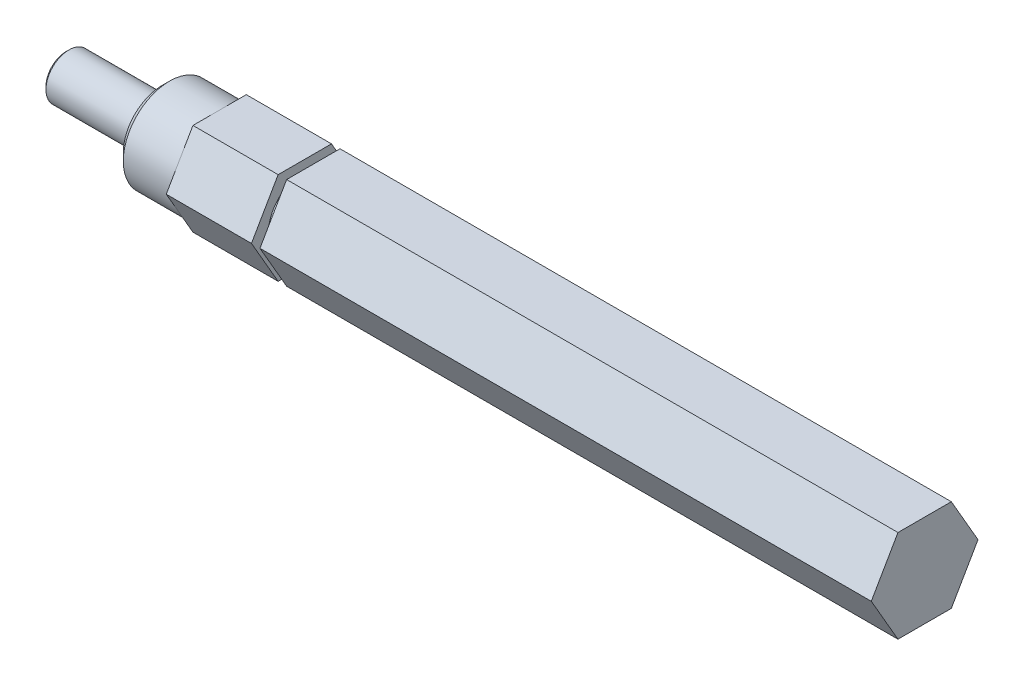
ISO-10303-21;
HEADER;
FILE_DESCRIPTION(('STEP AP214'),'2;1');
FILE_NAME('part.step','',(''),(''),'','','');
FILE_SCHEMA(('AUTOMOTIVE_DESIGN { 1 0 10303 214 1 1 1 1 }'));
ENDSEC;
DATA;
#1=APPLICATION_CONTEXT('core data for automotive mechanical design processes');
#2=APPLICATION_PROTOCOL_DEFINITION('international standard','automotive_design',2000,#1);
#3=PRODUCT_CONTEXT('',#1,'mechanical');
#4=PRODUCT('Part','Part','',(#3));
#5=PRODUCT_RELATED_PRODUCT_CATEGORY('part','',(#4));
#6=PRODUCT_DEFINITION_FORMATION('','',#4);
#7=PRODUCT_DEFINITION_CONTEXT('part definition',#1,'design');
#8=PRODUCT_DEFINITION('design','',#6,#7);
#9=PRODUCT_DEFINITION_SHAPE('','',#8);
#10=(LENGTH_UNIT() NAMED_UNIT(*) SI_UNIT(.MILLI.,.METRE.));
#11=(NAMED_UNIT(*) PLANE_ANGLE_UNIT() SI_UNIT($,.RADIAN.));
#12=(NAMED_UNIT(*) SI_UNIT($,.STERADIAN.) SOLID_ANGLE_UNIT());
#13=UNCERTAINTY_MEASURE_WITH_UNIT(LENGTH_MEASURE(1.E-05),#10,'distance_accuracy_value','');
#14=(GEOMETRIC_REPRESENTATION_CONTEXT(3) GLOBAL_UNCERTAINTY_ASSIGNED_CONTEXT((#13)) GLOBAL_UNIT_ASSIGNED_CONTEXT((#10,
#11,#12)) REPRESENTATION_CONTEXT('',''));
#15=CARTESIAN_POINT('',(0.,0.,0.));
#16=DIRECTION('',(0.,0.,1.));
#17=DIRECTION('',(1.,0.,0.));
#18=AXIS2_PLACEMENT_3D('',#15,#16,#17);
#19=CARTESIAN_POINT('',(41.275,0.,0.));
#20=DIRECTION('',(1.,0.,0.));
#21=DIRECTION('',(0.,0.,-1.));
#22=AXIS2_PLACEMENT_3D('',#19,#20,#21);
#23=PLANE('',#22);
#24=DIRECTION('',(0.,0.,1.));
#25=VECTOR('',#24,1.);
#26=CARTESIAN_POINT('',(41.275,6.35,-3.66617420935412));
#27=LINE('',#26,#25);
#28=CARTESIAN_POINT('',(41.275,6.34999999999995,-3.66617420935415));
#29=VERTEX_POINT('',#28);
#30=CARTESIAN_POINT('',(41.275,6.35,3.66617420935407));
#31=VERTEX_POINT('',#30);
#32=EDGE_CURVE('E193',#29,#31,#27,.T.);
#33=ORIENTED_EDGE('',*,*,#32,.T.);
#34=DIRECTION('',(0.,-0.866025403784439,0.499999999999999));
#35=VECTOR('',#34,1.);
#36=CARTESIAN_POINT('',(41.275,6.35,3.6661742093541));
#37=LINE('',#36,#35);
#38=CARTESIAN_POINT('',(41.275,0.,7.33234841870822));
#39=VERTEX_POINT('',#38);
#40=EDGE_CURVE('E201',#31,#39,#37,.T.);
#41=ORIENTED_EDGE('',*,*,#40,.T.);
#42=DIRECTION('',(0.,-0.866025403784439,-0.5));
#43=VECTOR('',#42,1.);
#44=CARTESIAN_POINT('',(41.275,0.,7.33234841870822));
#45=LINE('',#44,#43);
#46=CARTESIAN_POINT('',(41.275,-6.35000000000002,3.66617420935409));
#47=VERTEX_POINT('',#46);
#48=EDGE_CURVE('E192',#39,#47,#45,.T.);
#49=ORIENTED_EDGE('',*,*,#48,.T.);
#50=DIRECTION('',(0.,0.,-1.));
#51=VECTOR('',#50,1.);
#52=CARTESIAN_POINT('',(41.275,-6.35000000000002,3.66617420935409));
#53=LINE('',#52,#51);
#54=CARTESIAN_POINT('',(41.275,-6.35000000000002,-3.66617420935411));
#55=VERTEX_POINT('',#54);
#56=EDGE_CURVE('E178',#47,#55,#53,.T.);
#57=ORIENTED_EDGE('',*,*,#56,.T.);
#58=DIRECTION('',(0.,0.86602540378444,-0.499999999999999));
#59=VECTOR('',#58,1.);
#60=CARTESIAN_POINT('',(41.275,-6.35000000000002,-3.66617420935411));
#61=LINE('',#60,#59);
#62=CARTESIAN_POINT('',(41.275,0.,-7.33234841870822));
#63=VERTEX_POINT('',#62);
#64=EDGE_CURVE('E61',#55,#63,#61,.T.);
#65=ORIENTED_EDGE('',*,*,#64,.T.);
#66=DIRECTION('',(0.,0.866025403784439,0.5));
#67=VECTOR('',#66,1.);
#68=CARTESIAN_POINT('',(41.275,0.,-7.33234841870824));
#69=LINE('',#68,#67);
#70=EDGE_CURVE('E194',#63,#29,#69,.T.);
#71=ORIENTED_EDGE('',*,*,#70,.T.);
#72=EDGE_LOOP('',(#33,#41,#49,#57,#65,#71));
#73=FACE_BOUND('',#72,.T.);
#74=ADVANCED_FACE('F58',(#73),#23,.T.);
#75=CARTESIAN_POINT('',(63.5,6.35,3.6661742093541));
#76=DIRECTION('',(0.,-0.499999999999999,-0.866025403784439));
#77=DIRECTION('',(0.,0.866025403784439,-0.499999999999999));
#78=AXIS2_PLACEMENT_3D('',#75,#76,#77);
#79=PLANE('',#78);
#80=ORIENTED_EDGE('',*,*,#40,.F.);
#81=DIRECTION('',(1.,0.,0.));
#82=VECTOR('',#81,1.);
#83=CARTESIAN_POINT('',(63.5,6.35,3.66617420935407));
#84=LINE('',#83,#82);
#85=CARTESIAN_POINT('',(-42.7355,6.35,3.66617420935409));
#86=VERTEX_POINT('',#85);
#87=EDGE_CURVE('E163',#31,#86,#84,.F.);
#88=ORIENTED_EDGE('',*,*,#87,.T.);
#89=DIRECTION('',(0.,0.866025403784439,-0.499999999999999));
#90=VECTOR('',#89,1.);
#91=CARTESIAN_POINT('',(-42.7355,0.,7.33234841870822));
#92=LINE('',#91,#90);
#93=CARTESIAN_POINT('',(-42.7355,0.,7.33234841870822));
#94=VERTEX_POINT('',#93);
#95=EDGE_CURVE('E218',#94,#86,#92,.T.);
#96=ORIENTED_EDGE('',*,*,#95,.F.);
#97=DIRECTION('',(1.,0.,0.));
#98=VECTOR('',#97,1.);
#99=CARTESIAN_POINT('',(63.5,0.,7.33234841870822));
#100=LINE('',#99,#98);
#101=EDGE_CURVE('E156',#94,#39,#100,.T.);
#102=ORIENTED_EDGE('',*,*,#101,.T.);
#103=EDGE_LOOP('',(#80,#88,#96,#102));
#104=FACE_BOUND('',#103,.T.);
#105=ADVANCED_FACE('F417',(#104),#79,.F.);
#106=CARTESIAN_POINT('',(63.5,0.,7.33234841870822));
#107=DIRECTION('',(0.,0.5,-0.866025403784439));
#108=DIRECTION('',(0.,0.866025403784439,0.5));
#109=AXIS2_PLACEMENT_3D('',#106,#107,#108);
#110=PLANE('',#109);
#111=ORIENTED_EDGE('',*,*,#48,.F.);
#112=ORIENTED_EDGE('',*,*,#101,.F.);
#113=DIRECTION('',(0.,0.866025403784439,0.5));
#114=VECTOR('',#113,1.);
#115=CARTESIAN_POINT('',(-42.7355,-6.35000000000002,3.66617420935409));
#116=LINE('',#115,#114);
#117=CARTESIAN_POINT('',(-42.7355,-6.35000000000002,3.66617420935409));
#118=VERTEX_POINT('',#117);
#119=EDGE_CURVE('E211',#118,#94,#116,.T.);
#120=ORIENTED_EDGE('',*,*,#119,.F.);
#121=DIRECTION('',(1.,0.,0.));
#122=VECTOR('',#121,1.);
#123=CARTESIAN_POINT('',(63.5,-6.35000000000002,3.66617420935409));
#124=LINE('',#123,#122);
#125=EDGE_CURVE('E222',#118,#47,#124,.T.);
#126=ORIENTED_EDGE('',*,*,#125,.T.);
#127=EDGE_LOOP('',(#111,#112,#120,#126));
#128=FACE_BOUND('',#127,.T.);
#129=ADVANCED_FACE('F253',(#128),#110,.F.);
#130=CARTESIAN_POINT('',(63.5,6.35,-3.66617420935412));
#131=DIRECTION('',(0.,-1.,0.));
#132=DIRECTION('',(0.,0.,-1.));
#133=AXIS2_PLACEMENT_3D('',#130,#131,#132);
#134=PLANE('',#133);
#135=ORIENTED_EDGE('',*,*,#32,.F.);
#136=DIRECTION('',(1.,0.,0.));
#137=VECTOR('',#136,1.);
#138=CARTESIAN_POINT('',(63.5,6.34999999999995,-3.66617420935415));
#139=LINE('',#138,#137);
#140=CARTESIAN_POINT('',(-42.7355000000001,6.34999999999997,-3.66617420935414));
#141=VERTEX_POINT('',#140);
#142=EDGE_CURVE('E234',#29,#141,#139,.F.);
#143=ORIENTED_EDGE('',*,*,#142,.T.);
#144=DIRECTION('',(0.,0.,1.));
#145=VECTOR('',#144,1.);
#146=CARTESIAN_POINT('',(-42.7355,6.35,0.));
#147=LINE('',#146,#145);
#148=EDGE_CURVE('E215',#86,#141,#147,.F.);
#149=ORIENTED_EDGE('',*,*,#148,.F.);
#150=ORIENTED_EDGE('',*,*,#87,.F.);
#151=EDGE_LOOP('',(#135,#143,#149,#150));
#152=FACE_BOUND('',#151,.T.);
#153=ADVANCED_FACE('F251',(#152),#134,.F.);
#154=CARTESIAN_POINT('',(63.5,-6.35000000000002,3.66617420935409));
#155=DIRECTION('',(0.,1.,0.));
#156=DIRECTION('',(0.,0.,1.));
#157=AXIS2_PLACEMENT_3D('',#154,#155,#156);
#158=PLANE('',#157);
#159=ORIENTED_EDGE('',*,*,#56,.F.);
#160=ORIENTED_EDGE('',*,*,#125,.F.);
#161=DIRECTION('',(0.,0.,1.));
#162=VECTOR('',#161,1.);
#163=CARTESIAN_POINT('',(-42.7355,-6.35000000000002,3.66617420935409));
#164=LINE('',#163,#162);
#165=CARTESIAN_POINT('',(-42.7355000000001,-6.35000000000002,-3.66617420935411));
#166=VERTEX_POINT('',#165);
#167=EDGE_CURVE('E148',#166,#118,#164,.T.);
#168=ORIENTED_EDGE('',*,*,#167,.F.);
#169=DIRECTION('',(1.,0.,0.));
#170=VECTOR('',#169,1.);
#171=CARTESIAN_POINT('',(63.5,-6.35000000000002,-3.66617420935411));
#172=LINE('',#171,#170);
#173=EDGE_CURVE('E175',#166,#55,#172,.T.);
#174=ORIENTED_EDGE('',*,*,#173,.T.);
#175=EDGE_LOOP('',(#159,#160,#168,#174));
#176=FACE_BOUND('',#175,.T.);
#177=ADVANCED_FACE('F177',(#176),#158,.F.);
#178=CARTESIAN_POINT('',(63.5,0.,-7.33234841870824));
#179=DIRECTION('',(0.,-0.5,0.866025403784439));
#180=DIRECTION('',(0.,-0.866025403784439,-0.5));
#181=AXIS2_PLACEMENT_3D('',#178,#179,#180);
#182=PLANE('',#181);
#183=ORIENTED_EDGE('',*,*,#70,.F.);
#184=DIRECTION('',(1.,0.,0.));
#185=VECTOR('',#184,1.);
#186=CARTESIAN_POINT('',(63.5,0.,-7.33234841870822));
#187=LINE('',#186,#185);
#188=CARTESIAN_POINT('',(-42.7355000000001,0.,-7.33234841870823));
#189=VERTEX_POINT('',#188);
#190=EDGE_CURVE('E184',#63,#189,#187,.F.);
#191=ORIENTED_EDGE('',*,*,#190,.T.);
#192=DIRECTION('',(0.,-0.866025403784439,-0.5));
#193=VECTOR('',#192,1.);
#194=CARTESIAN_POINT('',(-42.7355000000001,0.,-7.33234841870824));
#195=LINE('',#194,#193);
#196=EDGE_CURVE('E224',#141,#189,#195,.T.);
#197=ORIENTED_EDGE('',*,*,#196,.F.);
#198=ORIENTED_EDGE('',*,*,#142,.F.);
#199=EDGE_LOOP('',(#183,#191,#197,#198));
#200=FACE_BOUND('',#199,.T.);
#201=ADVANCED_FACE('F250',(#200),#182,.F.);
#202=CARTESIAN_POINT('',(63.5,-6.35000000000002,-3.66617420935411));
#203=DIRECTION('',(0.,0.499999999999999,0.86602540378444));
#204=DIRECTION('',(0.,-0.86602540378444,0.499999999999999));
#205=AXIS2_PLACEMENT_3D('',#202,#203,#204);
#206=PLANE('',#205);
#207=ORIENTED_EDGE('',*,*,#64,.F.);
#208=ORIENTED_EDGE('',*,*,#173,.F.);
#209=DIRECTION('',(0.,-0.86602540378444,0.499999999999999));
#210=VECTOR('',#209,1.);
#211=CARTESIAN_POINT('',(-42.7355000000001,-6.35000000000002,-3.66617420935411));
#212=LINE('',#211,#210);
#213=EDGE_CURVE('E183',#189,#166,#212,.T.);
#214=ORIENTED_EDGE('',*,*,#213,.F.);
#215=ORIENTED_EDGE('',*,*,#190,.F.);
#216=EDGE_LOOP('',(#207,#208,#214,#215));
#217=FACE_BOUND('',#216,.T.);
#218=ADVANCED_FACE('F196',(#217),#206,.F.);
#219=CARTESIAN_POINT('',(-76.708,0.,0.));
#220=DIRECTION('',(-1.,0.,0.));
#221=DIRECTION('',(0.,0.,1.));
#222=AXIS2_PLACEMENT_3D('',#219,#220,#221);
#223=PLANE('',#222);
#224=CARTESIAN_POINT('',(-76.7079999999964,0.,0.));
#225=DIRECTION('',(1.,0.,0.));
#226=DIRECTION('',(0.,0.,-1.));
#227=AXIS2_PLACEMENT_3D('',#224,#225,#226);
#228=CIRCLE('',#227,2.76860000002443);
#229=CARTESIAN_POINT('',(-76.7079999999964,0.,-2.76860000002443));
#230=VERTEX_POINT('',#229);
#231=EDGE_CURVE('E12',#230,#230,#228,.T.);
#232=ORIENTED_EDGE('',*,*,#231,.F.);
#233=EDGE_LOOP('',(#232));
#234=FACE_BOUND('',#233,.T.);
#235=ADVANCED_FACE('F426',(#234),#223,.T.);
#236=CARTESIAN_POINT('',(-76.326999999992,0.,0.));
#237=DIRECTION('',(1.,0.,0.));
#238=DIRECTION('',(0.,0.,-1.));
#239=AXIS2_PLACEMENT_3D('',#236,#237,#238);
#240=CONICAL_SURFACE('',#239,3.149599999972,0.785398163322851);
#241=ORIENTED_EDGE('',*,*,#231,.T.);
#242=EDGE_LOOP('',(#241));
#243=FACE_BOUND('',#242,.T.);
#244=CARTESIAN_POINT('',(-76.327,0.,0.));
#245=DIRECTION('',(1.,0.,0.));
#246=DIRECTION('',(0.,0.,-1.));
#247=AXIS2_PLACEMENT_3D('',#244,#245,#246);
#248=CIRCLE('',#247,3.1496);
#249=CARTESIAN_POINT('',(-76.327,0.,-3.1496));
#250=VERTEX_POINT('',#249);
#251=EDGE_CURVE('E67',#250,#250,#248,.T.);
#252=ORIENTED_EDGE('',*,*,#251,.F.);
#253=EDGE_LOOP('',(#252));
#254=FACE_BOUND('',#253,.T.);
#255=ADVANCED_FACE('F440',(#243,#254),#240,.T.);
#256=CARTESIAN_POINT('',(-76.708,0.,0.));
#257=DIRECTION('',(1.,0.,0.));
#258=DIRECTION('',(0.,0.,-1.));
#259=AXIS2_PLACEMENT_3D('',#256,#257,#258);
#260=CYLINDRICAL_SURFACE('',#259,3.1496);
#261=ORIENTED_EDGE('',*,*,#251,.T.);
#262=EDGE_LOOP('',(#261));
#263=FACE_BOUND('',#262,.T.);
#264=CARTESIAN_POINT('',(-63.5,0.,0.));
#265=DIRECTION('',(1.,0.,0.));
#266=DIRECTION('',(0.,0.,-1.));
#267=AXIS2_PLACEMENT_3D('',#264,#265,#266);
#268=CIRCLE('',#267,3.1496);
#269=CARTESIAN_POINT('',(-63.5,0.,-3.1496));
#270=VERTEX_POINT('',#269);
#271=EDGE_CURVE('E374',#270,#270,#268,.F.);
#272=ORIENTED_EDGE('',*,*,#271,.T.);
#273=EDGE_LOOP('',(#272));
#274=FACE_BOUND('',#273,.T.);
#275=ADVANCED_FACE('F393',(#263,#274),#260,.T.);
#276=CARTESIAN_POINT('',(-63.5,0.,-7.33234841870824));
#277=DIRECTION('',(1.,0.,0.));
#278=DIRECTION('',(0.,0.,-1.));
#279=AXIS2_PLACEMENT_3D('',#276,#277,#278);
#280=PLANE('',#279);
#281=ORIENTED_EDGE('',*,*,#271,.F.);
#282=EDGE_LOOP('',(#281));
#283=FACE_BOUND('',#282,.T.);
#284=CARTESIAN_POINT('',(-63.4999999999764,0.,0.));
#285=DIRECTION('',(1.,0.,0.));
#286=DIRECTION('',(0.,0.,-1.));
#287=AXIS2_PLACEMENT_3D('',#284,#285,#286);
#288=CIRCLE('',#287,5.35000000002128);
#289=CARTESIAN_POINT('',(-63.4999999999764,0.,-5.35000000002128));
#290=VERTEX_POINT('',#289);
#291=EDGE_CURVE('E372',#290,#290,#288,.T.);
#292=ORIENTED_EDGE('',*,*,#291,.F.);
#293=EDGE_LOOP('',(#292));
#294=FACE_BOUND('',#293,.T.);
#295=ADVANCED_FACE('F395',(#283,#294),#280,.F.);
#296=CARTESIAN_POINT('',(-62.5000000001137,0.,0.));
#297=DIRECTION('',(1.,0.,0.));
#298=DIRECTION('',(0.,0.,-1.));
#299=AXIS2_PLACEMENT_3D('',#296,#297,#298);
#300=CONICAL_SURFACE('',#299,6.34999999988395,0.785398163397448);
#301=ORIENTED_EDGE('',*,*,#291,.T.);
#302=EDGE_LOOP('',(#301));
#303=FACE_BOUND('',#302,.T.);
#304=CARTESIAN_POINT('',(-62.5,0.,0.));
#305=DIRECTION('',(-1.,0.,0.));
#306=DIRECTION('',(0.,0.,1.));
#307=AXIS2_PLACEMENT_3D('',#304,#305,#306);
#308=CIRCLE('',#307,6.35);
#309=CARTESIAN_POINT('',(-62.5,0.,6.35));
#310=VERTEX_POINT('',#309);
#311=EDGE_CURVE('E369',#310,#310,#308,.F.);
#312=ORIENTED_EDGE('',*,*,#311,.F.);
#313=EDGE_LOOP('',(#312));
#314=FACE_BOUND('',#313,.T.);
#315=ADVANCED_FACE('F398',(#303,#314),#300,.T.);
#316=CARTESIAN_POINT('',(-55.6133,0.,0.));
#317=DIRECTION('',(-1.,0.,0.));
#318=DIRECTION('',(0.,0.,1.));
#319=AXIS2_PLACEMENT_3D('',#316,#317,#318);
#320=CYLINDRICAL_SURFACE('',#319,6.35);
#321=CARTESIAN_POINT('',(-55.6133,0.,0.));
#322=DIRECTION('',(-1.,0.,0.));
#323=DIRECTION('',(0.,0.,1.));
#324=AXIS2_PLACEMENT_3D('',#321,#322,#323);
#325=CIRCLE('',#324,6.35);
#326=CARTESIAN_POINT('',(-55.6133,-3.17499999999999,-5.49926131403119));
#327=VERTEX_POINT('',#326);
#328=CARTESIAN_POINT('',(-55.6133,3.175,-5.49926131403119));
#329=VERTEX_POINT('',#328);
#330=EDGE_CURVE('E76',#327,#329,#325,.F.);
#331=ORIENTED_EDGE('',*,*,#330,.F.);
#332=CARTESIAN_POINT('',(-55.6133,0.,0.));
#333=DIRECTION('',(-1.,0.,0.));
#334=DIRECTION('',(0.,0.,1.));
#335=AXIS2_PLACEMENT_3D('',#332,#333,#334);
#336=CIRCLE('',#335,6.35);
#337=CARTESIAN_POINT('',(-55.6133,-6.35000000000001,0.));
#338=VERTEX_POINT('',#337);
#339=EDGE_CURVE('E379',#338,#327,#336,.F.);
#340=ORIENTED_EDGE('',*,*,#339,.F.);
#341=CARTESIAN_POINT('',(-55.6133,0.,0.));
#342=DIRECTION('',(-1.,0.,0.));
#343=DIRECTION('',(0.,0.,1.));
#344=AXIS2_PLACEMENT_3D('',#341,#342,#343);
#345=CIRCLE('',#344,6.35);
#346=CARTESIAN_POINT('',(-55.6133,-3.175,5.49926131403118));
#347=VERTEX_POINT('',#346);
#348=EDGE_CURVE('E366',#347,#338,#345,.F.);
#349=ORIENTED_EDGE('',*,*,#348,.F.);
#350=CARTESIAN_POINT('',(-55.6133,0.,0.));
#351=DIRECTION('',(-1.,0.,0.));
#352=DIRECTION('',(0.,0.,1.));
#353=AXIS2_PLACEMENT_3D('',#350,#351,#352);
#354=CIRCLE('',#353,6.35);
#355=CARTESIAN_POINT('',(-55.6133,3.17499999999999,5.49926131403118));
#356=VERTEX_POINT('',#355);
#357=EDGE_CURVE('E381',#356,#347,#354,.F.);
#358=ORIENTED_EDGE('',*,*,#357,.F.);
#359=CARTESIAN_POINT('',(-55.6133,0.,0.));
#360=DIRECTION('',(-1.,0.,0.));
#361=DIRECTION('',(0.,0.,1.));
#362=AXIS2_PLACEMENT_3D('',#359,#360,#361);
#363=CIRCLE('',#362,6.35);
#364=CARTESIAN_POINT('',(-55.6133,6.35,0.));
#365=VERTEX_POINT('',#364);
#366=EDGE_CURVE('E383',#365,#356,#363,.F.);
#367=ORIENTED_EDGE('',*,*,#366,.F.);
#368=CARTESIAN_POINT('',(-55.6133,0.,0.));
#369=DIRECTION('',(-1.,0.,0.));
#370=DIRECTION('',(0.,0.,1.));
#371=AXIS2_PLACEMENT_3D('',#368,#369,#370);
#372=CIRCLE('',#371,6.35);
#373=EDGE_CURVE('E386',#329,#365,#372,.F.);
#374=ORIENTED_EDGE('',*,*,#373,.F.);
#375=EDGE_LOOP('',(#331,#340,#349,#358,#367,#374));
#376=FACE_BOUND('',#375,.T.);
#377=ORIENTED_EDGE('',*,*,#311,.T.);
#378=EDGE_LOOP('',(#377));
#379=FACE_BOUND('',#378,.T.);
#380=ADVANCED_FACE('F404',(#376,#379),#320,.T.);
#381=CARTESIAN_POINT('',(-55.6133,0.,0.));
#382=DIRECTION('',(-1.,0.,0.));
#383=DIRECTION('',(0.,0.,1.));
#384=AXIS2_PLACEMENT_3D('',#381,#382,#383);
#385=PLANE('',#384);
#386=DIRECTION('',(0.,-0.86602540378444,0.499999999999999));
#387=VECTOR('',#386,1.);
#388=CARTESIAN_POINT('',(-55.6133000000001,-6.35000000000002,-3.66617420935411));
#389=LINE('',#388,#387);
#390=CARTESIAN_POINT('',(-55.6133000000001,0.,-7.33234841870823));
#391=VERTEX_POINT('',#390);
#392=EDGE_CURVE('E302',#391,#327,#389,.T.);
#393=ORIENTED_EDGE('',*,*,#392,.T.);
#394=ORIENTED_EDGE('',*,*,#330,.T.);
#395=DIRECTION('',(0.,-0.866025403784439,-0.5));
#396=VECTOR('',#395,1.);
#397=CARTESIAN_POINT('',(-55.6133000000001,0.,-7.33234841870824));
#398=LINE('',#397,#396);
#399=EDGE_CURVE('E353',#329,#391,#398,.T.);
#400=ORIENTED_EDGE('',*,*,#399,.T.);
#401=EDGE_LOOP('',(#393,#394,#400));
#402=FACE_BOUND('',#401,.T.);
#403=ADVANCED_FACE('F409',(#402),#385,.T.);
#404=CARTESIAN_POINT('',(-55.6133,0.,0.));
#405=DIRECTION('',(-1.,0.,0.));
#406=DIRECTION('',(0.,0.,1.));
#407=AXIS2_PLACEMENT_3D('',#404,#405,#406);
#408=PLANE('',#407);
#409=DIRECTION('',(0.,-0.866025403784439,-0.5));
#410=VECTOR('',#409,1.);
#411=CARTESIAN_POINT('',(-55.6133000000001,0.,-7.33234841870824));
#412=LINE('',#411,#410);
#413=CARTESIAN_POINT('',(-55.6133,6.35000000000001,-3.66617420935409));
#414=VERTEX_POINT('',#413);
#415=EDGE_CURVE('E303',#414,#329,#412,.T.);
#416=ORIENTED_EDGE('',*,*,#415,.T.);
#417=ORIENTED_EDGE('',*,*,#373,.T.);
#418=DIRECTION('',(0.,0.,-1.));
#419=VECTOR('',#418,1.);
#420=CARTESIAN_POINT('',(-55.6133,6.35,-3.66617420935412));
#421=LINE('',#420,#419);
#422=EDGE_CURVE('E340',#365,#414,#421,.T.);
#423=ORIENTED_EDGE('',*,*,#422,.T.);
#424=EDGE_LOOP('',(#416,#417,#423));
#425=FACE_BOUND('',#424,.T.);
#426=ADVANCED_FACE('F414',(#425),#408,.T.);
#427=CARTESIAN_POINT('',(-55.6133,0.,0.));
#428=DIRECTION('',(-1.,0.,0.));
#429=DIRECTION('',(0.,0.,1.));
#430=AXIS2_PLACEMENT_3D('',#427,#428,#429);
#431=PLANE('',#430);
#432=ORIENTED_EDGE('',*,*,#366,.T.);
#433=DIRECTION('',(0.,0.866025403784439,-0.499999999999999));
#434=VECTOR('',#433,1.);
#435=CARTESIAN_POINT('',(-55.6133,6.35,3.6661742093541));
#436=LINE('',#435,#434);
#437=CARTESIAN_POINT('',(-55.6133,6.34999999999999,3.66617420935411));
#438=VERTEX_POINT('',#437);
#439=EDGE_CURVE('E325',#356,#438,#436,.T.);
#440=ORIENTED_EDGE('',*,*,#439,.T.);
#441=DIRECTION('',(0.,0.,-1.));
#442=VECTOR('',#441,1.);
#443=CARTESIAN_POINT('',(-55.6133,6.35,-3.66617420935412));
#444=LINE('',#443,#442);
#445=EDGE_CURVE('E336',#438,#365,#444,.T.);
#446=ORIENTED_EDGE('',*,*,#445,.T.);
#447=EDGE_LOOP('',(#432,#440,#446));
#448=FACE_BOUND('',#447,.T.);
#449=ADVANCED_FACE('F493',(#448),#431,.T.);
#450=CARTESIAN_POINT('',(-55.6133,0.,0.));
#451=DIRECTION('',(-1.,0.,0.));
#452=DIRECTION('',(0.,0.,1.));
#453=AXIS2_PLACEMENT_3D('',#450,#451,#452);
#454=PLANE('',#453);
#455=ORIENTED_EDGE('',*,*,#357,.T.);
#456=DIRECTION('',(0.,0.866025403784439,0.5));
#457=VECTOR('',#456,1.);
#458=CARTESIAN_POINT('',(-55.6133,0.,7.33234841870822));
#459=LINE('',#458,#457);
#460=CARTESIAN_POINT('',(-55.6133,0.,7.33234841870822));
#461=VERTEX_POINT('',#460);
#462=EDGE_CURVE('E292',#347,#461,#459,.T.);
#463=ORIENTED_EDGE('',*,*,#462,.T.);
#464=DIRECTION('',(0.,0.866025403784439,-0.499999999999999));
#465=VECTOR('',#464,1.);
#466=CARTESIAN_POINT('',(-55.6133,6.35,3.6661742093541));
#467=LINE('',#466,#465);
#468=EDGE_CURVE('E321',#461,#356,#467,.T.);
#469=ORIENTED_EDGE('',*,*,#468,.T.);
#470=EDGE_LOOP('',(#455,#463,#469));
#471=FACE_BOUND('',#470,.T.);
#472=ADVANCED_FACE('F489',(#471),#454,.T.);
#473=CARTESIAN_POINT('',(-55.6133,0.,0.));
#474=DIRECTION('',(-1.,0.,0.));
#475=DIRECTION('',(0.,0.,1.));
#476=AXIS2_PLACEMENT_3D('',#473,#474,#475);
#477=PLANE('',#476);
#478=DIRECTION('',(0.,0.,1.));
#479=VECTOR('',#478,1.);
#480=CARTESIAN_POINT('',(-55.6133,-6.35000000000002,3.66617420935409));
#481=LINE('',#480,#479);
#482=CARTESIAN_POINT('',(-55.6133,-6.35000000000003,-3.6661742093541));
#483=VERTEX_POINT('',#482);
#484=EDGE_CURVE('E272',#483,#338,#481,.T.);
#485=ORIENTED_EDGE('',*,*,#484,.T.);
#486=ORIENTED_EDGE('',*,*,#339,.T.);
#487=DIRECTION('',(0.,-0.86602540378444,0.499999999999999));
#488=VECTOR('',#487,1.);
#489=CARTESIAN_POINT('',(-55.6133000000001,-6.35000000000002,-3.66617420935411));
#490=LINE('',#489,#488);
#491=EDGE_CURVE('E300',#327,#483,#490,.T.);
#492=ORIENTED_EDGE('',*,*,#491,.T.);
#493=EDGE_LOOP('',(#485,#486,#492));
#494=FACE_BOUND('',#493,.T.);
#495=ADVANCED_FACE('F485',(#494),#477,.T.);
#496=CARTESIAN_POINT('',(-55.6133,0.,0.));
#497=DIRECTION('',(-1.,0.,0.));
#498=DIRECTION('',(0.,0.,1.));
#499=AXIS2_PLACEMENT_3D('',#496,#497,#498);
#500=PLANE('',#499);
#501=ORIENTED_EDGE('',*,*,#348,.T.);
#502=DIRECTION('',(0.,0.,1.));
#503=VECTOR('',#502,1.);
#504=CARTESIAN_POINT('',(-55.6133,-6.35000000000002,3.66617420935409));
#505=LINE('',#504,#503);
#506=CARTESIAN_POINT('',(-55.6133,-6.35000000000002,3.66617420935407));
#507=VERTEX_POINT('',#506);
#508=EDGE_CURVE('E276',#338,#507,#505,.T.);
#509=ORIENTED_EDGE('',*,*,#508,.T.);
#510=DIRECTION('',(0.,0.866025403784439,0.5));
#511=VECTOR('',#510,1.);
#512=CARTESIAN_POINT('',(-55.6133,0.,7.33234841870822));
#513=LINE('',#512,#511);
#514=EDGE_CURVE('E288',#507,#347,#513,.T.);
#515=ORIENTED_EDGE('',*,*,#514,.T.);
#516=EDGE_LOOP('',(#501,#509,#515));
#517=FACE_BOUND('',#516,.T.);
#518=ADVANCED_FACE('F481',(#517),#500,.T.);
#519=CARTESIAN_POINT('',(63.5,-6.35000000000002,-3.66617420935411));
#520=DIRECTION('',(0.,0.499999999999999,0.86602540378444));
#521=DIRECTION('',(0.,-0.86602540378444,0.499999999999999));
#522=AXIS2_PLACEMENT_3D('',#519,#520,#521);
#523=PLANE('',#522);
#524=DIRECTION('',(1.,0.,0.));
#525=VECTOR('',#524,1.);
#526=CARTESIAN_POINT('',(63.5,-6.35000000000002,-3.66617420935411));
#527=LINE('',#526,#525);
#528=CARTESIAN_POINT('',(-43.9039,-6.35000000000002,-3.66617420935411));
#529=VERTEX_POINT('',#528);
#530=EDGE_CURVE('E275',#529,#483,#527,.F.);
#531=ORIENTED_EDGE('',*,*,#530,.T.);
#532=ORIENTED_EDGE('',*,*,#491,.F.);
#533=ORIENTED_EDGE('',*,*,#392,.F.);
#534=DIRECTION('',(1.,0.,0.));
#535=VECTOR('',#534,1.);
#536=CARTESIAN_POINT('',(63.5,0.,-7.33234841870822));
#537=LINE('',#536,#535);
#538=CARTESIAN_POINT('',(-43.9039,0.,-7.33234841870823));
#539=VERTEX_POINT('',#538);
#540=EDGE_CURVE('E339',#391,#539,#537,.T.);
#541=ORIENTED_EDGE('',*,*,#540,.T.);
#542=DIRECTION('',(0.,0.86602540378444,-0.499999999999999));
#543=VECTOR('',#542,1.);
#544=CARTESIAN_POINT('',(-43.9039,-6.35000000000002,-3.66617420935411));
#545=LINE('',#544,#543);
#546=EDGE_CURVE('E271',#529,#539,#545,.T.);
#547=ORIENTED_EDGE('',*,*,#546,.F.);
#548=EDGE_LOOP('',(#531,#532,#533,#541,#547));
#549=FACE_BOUND('',#548,.T.);
#550=ADVANCED_FACE('F477',(#549),#523,.F.);
#551=CARTESIAN_POINT('',(63.5,0.,-7.33234841870824));
#552=DIRECTION('',(0.,-0.5,0.866025403784439));
#553=DIRECTION('',(0.,-0.866025403784439,-0.5));
#554=AXIS2_PLACEMENT_3D('',#551,#552,#553);
#555=PLANE('',#554);
#556=ORIENTED_EDGE('',*,*,#540,.F.);
#557=ORIENTED_EDGE('',*,*,#399,.F.);
#558=ORIENTED_EDGE('',*,*,#415,.F.);
#559=DIRECTION('',(1.,0.,0.));
#560=VECTOR('',#559,1.);
#561=CARTESIAN_POINT('',(63.5,6.35,-3.66617420935407));
#562=LINE('',#561,#560);
#563=CARTESIAN_POINT('',(-43.9039,6.35,-3.66617420935411));
#564=VERTEX_POINT('',#563);
#565=EDGE_CURVE('E324',#414,#564,#562,.T.);
#566=ORIENTED_EDGE('',*,*,#565,.T.);
#567=DIRECTION('',(0.,0.866025403784439,0.5));
#568=VECTOR('',#567,1.);
#569=CARTESIAN_POINT('',(-43.9039,0.,-7.33234841870824));
#570=LINE('',#569,#568);
#571=EDGE_CURVE('E269',#539,#564,#570,.T.);
#572=ORIENTED_EDGE('',*,*,#571,.F.);
#573=EDGE_LOOP('',(#556,#557,#558,#566,#572));
#574=FACE_BOUND('',#573,.T.);
#575=ADVANCED_FACE('F473',(#574),#555,.F.);
#576=CARTESIAN_POINT('',(63.5,6.35,-3.66617420935412));
#577=DIRECTION('',(0.,-1.,0.));
#578=DIRECTION('',(0.,0.,-1.));
#579=AXIS2_PLACEMENT_3D('',#576,#577,#578);
#580=PLANE('',#579);
#581=ORIENTED_EDGE('',*,*,#565,.F.);
#582=ORIENTED_EDGE('',*,*,#422,.F.);
#583=ORIENTED_EDGE('',*,*,#445,.F.);
#584=DIRECTION('',(1.,0.,0.));
#585=VECTOR('',#584,1.);
#586=CARTESIAN_POINT('',(63.5,6.34999999999997,3.66617420935412));
#587=LINE('',#586,#585);
#588=CARTESIAN_POINT('',(-43.9039,6.34999999999999,3.6661742093541));
#589=VERTEX_POINT('',#588);
#590=EDGE_CURVE('E291',#438,#589,#587,.T.);
#591=ORIENTED_EDGE('',*,*,#590,.T.);
#592=DIRECTION('',(0.,0.,-1.));
#593=VECTOR('',#592,1.);
#594=CARTESIAN_POINT('',(-43.9039,6.35,0.));
#595=LINE('',#594,#593);
#596=EDGE_CURVE('E267',#564,#589,#595,.F.);
#597=ORIENTED_EDGE('',*,*,#596,.F.);
#598=EDGE_LOOP('',(#581,#582,#583,#591,#597));
#599=FACE_BOUND('',#598,.T.);
#600=ADVANCED_FACE('F469',(#599),#580,.F.);
#601=CARTESIAN_POINT('',(63.5,6.35,3.6661742093541));
#602=DIRECTION('',(0.,-0.499999999999999,-0.866025403784439));
#603=DIRECTION('',(0.,0.866025403784439,-0.499999999999999));
#604=AXIS2_PLACEMENT_3D('',#601,#602,#603);
#605=PLANE('',#604);
#606=ORIENTED_EDGE('',*,*,#590,.F.);
#607=ORIENTED_EDGE('',*,*,#439,.F.);
#608=ORIENTED_EDGE('',*,*,#468,.F.);
#609=DIRECTION('',(1.,0.,0.));
#610=VECTOR('',#609,1.);
#611=CARTESIAN_POINT('',(63.5,0.,7.33234841870822));
#612=LINE('',#611,#610);
#613=CARTESIAN_POINT('',(-43.9039,0.,7.33234841870822));
#614=VERTEX_POINT('',#613);
#615=EDGE_CURVE('E297',#461,#614,#612,.T.);
#616=ORIENTED_EDGE('',*,*,#615,.T.);
#617=DIRECTION('',(0.,-0.866025403784439,0.499999999999999));
#618=VECTOR('',#617,1.);
#619=CARTESIAN_POINT('',(-43.9039,6.35,3.6661742093541));
#620=LINE('',#619,#618);
#621=EDGE_CURVE('E264',#589,#614,#620,.T.);
#622=ORIENTED_EDGE('',*,*,#621,.F.);
#623=EDGE_LOOP('',(#606,#607,#608,#616,#622));
#624=FACE_BOUND('',#623,.T.);
#625=ADVANCED_FACE('F465',(#624),#605,.F.);
#626=CARTESIAN_POINT('',(63.5,0.,7.33234841870822));
#627=DIRECTION('',(0.,0.5,-0.866025403784439));
#628=DIRECTION('',(0.,0.866025403784439,0.5));
#629=AXIS2_PLACEMENT_3D('',#626,#627,#628);
#630=PLANE('',#629);
#631=ORIENTED_EDGE('',*,*,#615,.F.);
#632=ORIENTED_EDGE('',*,*,#462,.F.);
#633=ORIENTED_EDGE('',*,*,#514,.F.);
#634=DIRECTION('',(1.,0.,0.));
#635=VECTOR('',#634,1.);
#636=CARTESIAN_POINT('',(63.5,-6.35000000000002,3.66617420935404));
#637=LINE('',#636,#635);
#638=CARTESIAN_POINT('',(-43.9039,-6.35000000000002,3.66617420935408));
#639=VERTEX_POINT('',#638);
#640=EDGE_CURVE('E281',#507,#639,#637,.T.);
#641=ORIENTED_EDGE('',*,*,#640,.T.);
#642=DIRECTION('',(0.,-0.866025403784439,-0.5));
#643=VECTOR('',#642,1.);
#644=CARTESIAN_POINT('',(-43.9039,0.,7.33234841870822));
#645=LINE('',#644,#643);
#646=EDGE_CURVE('E262',#614,#639,#645,.T.);
#647=ORIENTED_EDGE('',*,*,#646,.F.);
#648=EDGE_LOOP('',(#631,#632,#633,#641,#647));
#649=FACE_BOUND('',#648,.T.);
#650=ADVANCED_FACE('F461',(#649),#630,.F.);
#651=CARTESIAN_POINT('',(63.5,-6.35000000000002,3.66617420935409));
#652=DIRECTION('',(0.,1.,0.));
#653=DIRECTION('',(0.,0.,1.));
#654=AXIS2_PLACEMENT_3D('',#651,#652,#653);
#655=PLANE('',#654);
#656=ORIENTED_EDGE('',*,*,#640,.F.);
#657=ORIENTED_EDGE('',*,*,#508,.F.);
#658=ORIENTED_EDGE('',*,*,#484,.F.);
#659=ORIENTED_EDGE('',*,*,#530,.F.);
#660=DIRECTION('',(0.,0.,-1.));
#661=VECTOR('',#660,1.);
#662=CARTESIAN_POINT('',(-43.9039,-6.35000000000002,0.));
#663=LINE('',#662,#661);
#664=EDGE_CURVE('E265',#639,#529,#663,.T.);
#665=ORIENTED_EDGE('',*,*,#664,.F.);
#666=EDGE_LOOP('',(#656,#657,#658,#659,#665));
#667=FACE_BOUND('',#666,.T.);
#668=ADVANCED_FACE('F453',(#667),#655,.F.);
#669=CARTESIAN_POINT('',(-43.9039,7.5692,0.));
#670=DIRECTION('',(1.,0.,0.));
#671=DIRECTION('',(0.,0.,-1.));
#672=AXIS2_PLACEMENT_3D('',#669,#670,#671);
#673=PLANE('',#672);
#674=ORIENTED_EDGE('',*,*,#646,.T.);
#675=ORIENTED_EDGE('',*,*,#664,.T.);
#676=ORIENTED_EDGE('',*,*,#546,.T.);
#677=ORIENTED_EDGE('',*,*,#571,.T.);
#678=ORIENTED_EDGE('',*,*,#596,.T.);
#679=ORIENTED_EDGE('',*,*,#621,.T.);
#680=EDGE_LOOP('',(#674,#675,#676,#677,#678,#679));
#681=FACE_BOUND('',#680,.T.);
#682=CARTESIAN_POINT('',(-43.9039,0.,0.));
#683=DIRECTION('',(-1.,0.,0.));
#684=DIRECTION('',(0.,0.,1.));
#685=AXIS2_PLACEMENT_3D('',#682,#683,#684);
#686=CIRCLE('',#685,5.0292);
#687=CARTESIAN_POINT('',(-43.9039,0.,5.0292));
#688=VERTEX_POINT('',#687);
#689=EDGE_CURVE('E210',#688,#688,#686,.F.);
#690=ORIENTED_EDGE('',*,*,#689,.F.);
#691=EDGE_LOOP('',(#690));
#692=FACE_BOUND('',#691,.T.);
#693=ADVANCED_FACE('F448',(#681,#692),#673,.T.);
#694=CARTESIAN_POINT('',(-78.984221990192,0.,0.));
#695=DIRECTION('',(-1.,0.,0.));
#696=DIRECTION('',(0.,0.,1.));
#697=AXIS2_PLACEMENT_3D('',#694,#695,#696);
#698=CYLINDRICAL_SURFACE('',#697,5.0292);
#699=CARTESIAN_POINT('',(-42.7355,0.,0.));
#700=DIRECTION('',(-1.,0.,0.));
#701=DIRECTION('',(0.,0.,1.));
#702=AXIS2_PLACEMENT_3D('',#699,#700,#701);
#703=CIRCLE('',#702,5.0292);
#704=CARTESIAN_POINT('',(-42.7355,0.,5.0292));
#705=VERTEX_POINT('',#704);
#706=EDGE_CURVE('E254',#705,#705,#703,.F.);
#707=ORIENTED_EDGE('',*,*,#706,.F.);
#708=EDGE_LOOP('',(#707));
#709=FACE_BOUND('',#708,.T.);
#710=ORIENTED_EDGE('',*,*,#689,.T.);
#711=EDGE_LOOP('',(#710));
#712=FACE_BOUND('',#711,.T.);
#713=ADVANCED_FACE('F444',(#709,#712),#698,.T.);
#714=CARTESIAN_POINT('',(-42.7355,7.5692,0.));
#715=DIRECTION('',(-1.,0.,0.));
#716=DIRECTION('',(0.,0.,1.));
#717=AXIS2_PLACEMENT_3D('',#714,#715,#716);
#718=PLANE('',#717);
#719=ORIENTED_EDGE('',*,*,#148,.T.);
#720=ORIENTED_EDGE('',*,*,#196,.T.);
#721=ORIENTED_EDGE('',*,*,#213,.T.);
#722=ORIENTED_EDGE('',*,*,#167,.T.);
#723=ORIENTED_EDGE('',*,*,#119,.T.);
#724=ORIENTED_EDGE('',*,*,#95,.T.);
#725=EDGE_LOOP('',(#719,#720,#721,#722,#723,#724));
#726=FACE_BOUND('',#725,.T.);
#727=ORIENTED_EDGE('',*,*,#706,.T.);
#728=EDGE_LOOP('',(#727));
#729=FACE_BOUND('',#728,.T.);
#730=ADVANCED_FACE('F244',(#726,#729),#718,.T.);
#731=CLOSED_SHELL('',(#74,#105,#129,#153,#177,#201,#218,#235,#255,#275,#295,#315,#380,#403,#426,
#449,#472,#495,#518,#550,#575,#600,#625,#650,#668,#693,#713,#730));
#732=MANIFOLD_SOLID_BREP('B2',#731);
#733=ADVANCED_BREP_SHAPE_REPRESENTATION('',(#18,#732),#14);
#734=SHAPE_DEFINITION_REPRESENTATION(#9,#733);
ENDSEC;
END-ISO-10303-21;
